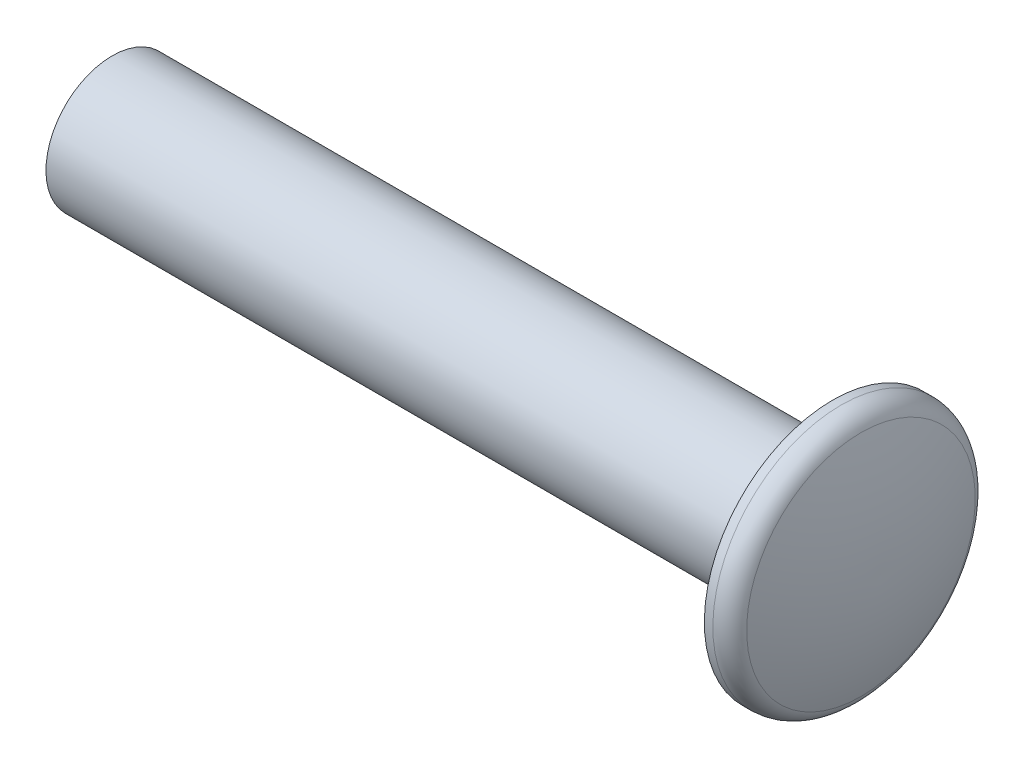
ISO-10303-21;
HEADER;
FILE_DESCRIPTION(('STEP AP214'),'2;1');
FILE_NAME('part.step','',(''),(''),'','','');
FILE_SCHEMA(('AUTOMOTIVE_DESIGN { 1 0 10303 214 1 1 1 1 }'));
ENDSEC;
DATA;
#1=APPLICATION_CONTEXT('core data for automotive mechanical design processes');
#2=APPLICATION_PROTOCOL_DEFINITION('international standard','automotive_design',2000,#1);
#3=PRODUCT_CONTEXT('',#1,'mechanical');
#4=PRODUCT('Part','Part','',(#3));
#5=PRODUCT_RELATED_PRODUCT_CATEGORY('part','',(#4));
#6=PRODUCT_DEFINITION_FORMATION('','',#4);
#7=PRODUCT_DEFINITION_CONTEXT('part definition',#1,'design');
#8=PRODUCT_DEFINITION('design','',#6,#7);
#9=PRODUCT_DEFINITION_SHAPE('','',#8);
#10=(LENGTH_UNIT() NAMED_UNIT(*) SI_UNIT(.MILLI.,.METRE.));
#11=(NAMED_UNIT(*) PLANE_ANGLE_UNIT() SI_UNIT($,.RADIAN.));
#12=(NAMED_UNIT(*) SI_UNIT($,.STERADIAN.) SOLID_ANGLE_UNIT());
#13=UNCERTAINTY_MEASURE_WITH_UNIT(LENGTH_MEASURE(1.E-05),#10,'distance_accuracy_value','');
#14=(GEOMETRIC_REPRESENTATION_CONTEXT(3) GLOBAL_UNCERTAINTY_ASSIGNED_CONTEXT((#13)) GLOBAL_UNIT_ASSIGNED_CONTEXT((#10,
#11,#12)) REPRESENTATION_CONTEXT('',''));
#15=CARTESIAN_POINT('',(0.,0.,0.));
#16=DIRECTION('',(0.,0.,1.));
#17=DIRECTION('',(1.,0.,0.));
#18=AXIS2_PLACEMENT_3D('',#15,#16,#17);
#19=CARTESIAN_POINT('',(10.097958734967,-46.7197863583504,0.));
#20=DIRECTION('',(1.,0.,0.));
#21=DIRECTION('',(0.,1.,0.));
#22=AXIS2_PLACEMENT_3D('',#19,#20,#21);
#23=PLANE('',#22);
#24=CARTESIAN_POINT('',(10.097958734967,-42.7510363583504,0.));
#25=DIRECTION('',(1.,0.,0.));
#26=DIRECTION('',(0.,1.,0.));
#27=AXIS2_PLACEMENT_3D('',#24,#25,#26);
#28=CIRCLE('',#27,3.96875);
#29=CARTESIAN_POINT('',(10.097958734967,-38.7822863583504,0.));
#30=VERTEX_POINT('',#29);
#31=EDGE_CURVE('E61',#30,#30,#28,.T.);
#32=ORIENTED_EDGE('',*,*,#31,.F.);
#33=EDGE_LOOP('',(#32));
#34=FACE_BOUND('',#33,.T.);
#35=ADVANCED_FACE('F32',(#34),#23,.F.);
#36=CARTESIAN_POINT('',(37.0880124389854,-42.4391235472979,0.));
#37=DIRECTION('',(0.,0.,-1.));
#38=DIRECTION('',(0.,1.,0.));
#39=AXIS2_PLACEMENT_3D('',#36,#37,#38);
#40=CIRCLE('',#39,19.05);
#41=TRIMMED_CURVE('',#40,(PARAMETER_VALUE(-1.58717043437417)),
(PARAMETER_VALUE(1.58717043437417)),.T.,.PARAMETER.);
#42=CARTESIAN_POINT('',(37.0880124389854,-42.7510363583504,0.));
#43=DIRECTION('',(1.,0.,0.));
#44=AXIS1_PLACEMENT('',#42,#43);
#45=SURFACE_OF_REVOLUTION('',#41,#44);
#46=CARTESIAN_POINT('',(56.135458734967,-42.7510363583504,0.));
#47=VERTEX_POINT('',#46);
#48=VERTEX_LOOP('',#47);
#49=FACE_BOUND('',#48,.T.);
#50=CARTESIAN_POINT('',(54.980667117183,-42.7510363583504,0.));
#51=DIRECTION('',(1.,0.,0.));
#52=DIRECTION('',(0.,1.,0.));
#53=AXIS2_PLACEMENT_3D('',#50,#51,#52);
#54=CIRCLE('',#53,6.85067481672099);
#55=CARTESIAN_POINT('',(54.980667117183,-35.9003615416294,0.));
#56=VERTEX_POINT('',#55);
#57=EDGE_CURVE('E11',#56,#56,#54,.T.);
#58=ORIENTED_EDGE('',*,*,#57,.T.);
#59=EDGE_LOOP('',(#58));
#60=FACE_BOUND('',#59,.T.);
#61=ADVANCED_FACE('F41',(#49,#60),#45,.T.);
#62=CARTESIAN_POINT('',(53.7878234719699,-42.7510363583504,0.));
#63=DIRECTION('',(1.,0.,0.));
#64=DIRECTION('',(0.,1.,0.));
#65=AXIS2_PLACEMENT_3D('',#62,#63,#64);
#66=TOROIDAL_SURFACE('',#65,6.41475734967643,1.27);
#67=ORIENTED_EDGE('',*,*,#57,.F.);
#68=EDGE_LOOP('',(#67));
#69=FACE_BOUND('',#68,.T.);
#70=CARTESIAN_POINT('',(53.7878234719699,-42.7510363583504,0.));
#71=DIRECTION('',(1.,0.,0.));
#72=DIRECTION('',(0.,1.,0.));
#73=AXIS2_PLACEMENT_3D('',#70,#71,#72);
#74=CIRCLE('',#73,7.68475734967642);
#75=CARTESIAN_POINT('',(53.7878234719699,-35.066279008674,0.));
#76=VERTEX_POINT('',#75);
#77=EDGE_CURVE('E38',#76,#76,#74,.T.);
#78=ORIENTED_EDGE('',*,*,#77,.T.);
#79=EDGE_LOOP('',(#78));
#80=FACE_BOUND('',#79,.T.);
#81=ADVANCED_FACE('F44',(#69,#80),#66,.T.);
#82=CARTESIAN_POINT('',(56.135458734967,-42.7510363583504,0.));
#83=DIRECTION('',(1.,0.,0.));
#84=DIRECTION('',(0.,1.,0.));
#85=AXIS2_PLACEMENT_3D('',#82,#83,#84);
#86=CYLINDRICAL_SURFACE('',#85,7.68475734967642);
#87=ORIENTED_EDGE('',*,*,#77,.F.);
#88=EDGE_LOOP('',(#87));
#89=FACE_BOUND('',#88,.T.);
#90=CARTESIAN_POINT('',(53.277958734967,-42.7510363583504,0.));
#91=DIRECTION('',(1.,0.,0.));
#92=DIRECTION('',(0.,1.,0.));
#93=AXIS2_PLACEMENT_3D('',#90,#91,#92);
#94=CIRCLE('',#93,7.68475734967642);
#95=CARTESIAN_POINT('',(53.277958734967,-35.066279008674,0.));
#96=VERTEX_POINT('',#95);
#97=EDGE_CURVE('E54',#96,#96,#94,.T.);
#98=ORIENTED_EDGE('',*,*,#97,.T.);
#99=EDGE_LOOP('',(#98));
#100=FACE_BOUND('',#99,.T.);
#101=ADVANCED_FACE('F49',(#89,#100),#86,.T.);
#102=CARTESIAN_POINT('',(53.277958734967,-46.7197863583504,0.));
#103=DIRECTION('',(1.,0.,0.));
#104=DIRECTION('',(0.,1.,0.));
#105=AXIS2_PLACEMENT_3D('',#102,#103,#104);
#106=PLANE('',#105);
#107=ORIENTED_EDGE('',*,*,#97,.F.);
#108=EDGE_LOOP('',(#107));
#109=FACE_BOUND('',#108,.T.);
#110=CARTESIAN_POINT('',(53.277958734967,-42.7510363583504,0.));
#111=DIRECTION('',(1.,0.,0.));
#112=DIRECTION('',(0.,1.,0.));
#113=AXIS2_PLACEMENT_3D('',#110,#111,#112);
#114=CIRCLE('',#113,3.96875000000001);
#115=CARTESIAN_POINT('',(53.277958734967,-38.7822863583504,0.));
#116=VERTEX_POINT('',#115);
#117=EDGE_CURVE('E56',#116,#116,#114,.T.);
#118=ORIENTED_EDGE('',*,*,#117,.T.);
#119=EDGE_LOOP('',(#118));
#120=FACE_BOUND('',#119,.T.);
#121=ADVANCED_FACE('F84',(#109,#120),#106,.F.);
#122=CARTESIAN_POINT('',(56.135458734967,-42.7510363583504,0.));
#123=DIRECTION('',(1.,0.,0.));
#124=DIRECTION('',(0.,1.,0.));
#125=AXIS2_PLACEMENT_3D('',#122,#123,#124);
#126=CYLINDRICAL_SURFACE('',#125,3.96875);
#127=ORIENTED_EDGE('',*,*,#117,.F.);
#128=EDGE_LOOP('',(#127));
#129=FACE_BOUND('',#128,.T.);
#130=ORIENTED_EDGE('',*,*,#31,.T.);
#131=EDGE_LOOP('',(#130));
#132=FACE_BOUND('',#131,.T.);
#133=ADVANCED_FACE('F65',(#129,#132),#126,.T.);
#134=CLOSED_SHELL('',(#35,#61,#81,#101,#121,#133));
#135=MANIFOLD_SOLID_BREP('B2',#134);
#136=ADVANCED_BREP_SHAPE_REPRESENTATION('',(#18,#135),#14);
#137=SHAPE_DEFINITION_REPRESENTATION(#9,#136);
ENDSEC;
END-ISO-10303-21;
